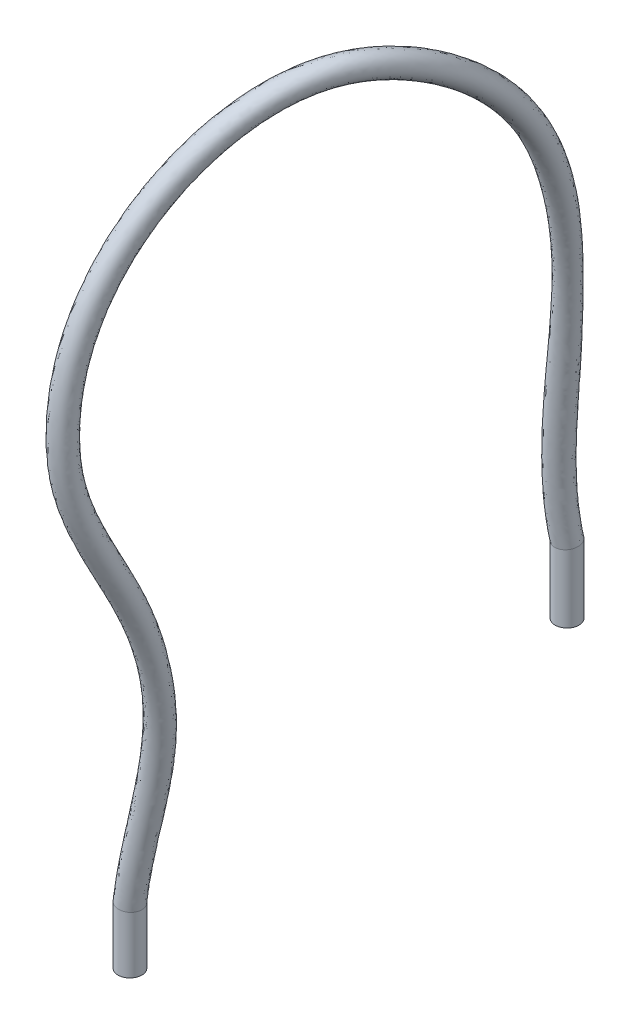
ISO-10303-21;
HEADER;
FILE_DESCRIPTION(('STEP AP214'),'2;1');
FILE_NAME('part.step','',(''),(''),'','','');
FILE_SCHEMA(('AUTOMOTIVE_DESIGN { 1 0 10303 214 1 1 1 1 }'));
ENDSEC;
DATA;
#1=APPLICATION_CONTEXT('core data for automotive mechanical design processes');
#2=APPLICATION_PROTOCOL_DEFINITION('international standard','automotive_design',2000,#1);
#3=PRODUCT_CONTEXT('',#1,'mechanical');
#4=PRODUCT('Part','Part','',(#3));
#5=PRODUCT_RELATED_PRODUCT_CATEGORY('part','',(#4));
#6=PRODUCT_DEFINITION_FORMATION('','',#4);
#7=PRODUCT_DEFINITION_CONTEXT('part definition',#1,'design');
#8=PRODUCT_DEFINITION('design','',#6,#7);
#9=PRODUCT_DEFINITION_SHAPE('','',#8);
#10=(LENGTH_UNIT() NAMED_UNIT(*) SI_UNIT(.MILLI.,.METRE.));
#11=(NAMED_UNIT(*) PLANE_ANGLE_UNIT() SI_UNIT($,.RADIAN.));
#12=(NAMED_UNIT(*) SI_UNIT($,.STERADIAN.) SOLID_ANGLE_UNIT());
#13=UNCERTAINTY_MEASURE_WITH_UNIT(LENGTH_MEASURE(1.E-05),#10,'distance_accuracy_value','');
#14=(GEOMETRIC_REPRESENTATION_CONTEXT(3) GLOBAL_UNCERTAINTY_ASSIGNED_CONTEXT((#13)) GLOBAL_UNIT_ASSIGNED_CONTEXT((#10,
#11,#12)) REPRESENTATION_CONTEXT('',''));
#15=CARTESIAN_POINT('',(0.,0.,0.));
#16=DIRECTION('',(0.,0.,1.));
#17=DIRECTION('',(1.,0.,0.));
#18=AXIS2_PLACEMENT_3D('',#15,#16,#17);
#19=CARTESIAN_POINT('',(25.3532665051609,-57.0295507088447,-38.7450873487546));
#20=DIRECTION('',(0.,-1.,0.));
#21=DIRECTION('',(0.,0.,-1.));
#22=AXIS2_PLACEMENT_3D('',#19,#20,#21);
#23=PLANE('',#22);
#24=CARTESIAN_POINT('',(25.3532665051609,-57.0295507088447,-38.7450873487546));
#25=DIRECTION('',(0.,-1.,0.));
#26=DIRECTION('',(0.,0.,-1.));
#27=AXIS2_PLACEMENT_3D('',#24,#25,#26);
#28=CIRCLE('',#27,1.);
#29=CARTESIAN_POINT('',(25.3532665051609,-57.0295507088447,-39.7450873487547));
#30=VERTEX_POINT('',#29);
#31=EDGE_CURVE('E10',#30,#30,#28,.T.);
#32=ORIENTED_EDGE('',*,*,#31,.T.);
#33=EDGE_LOOP('',(#32));
#34=FACE_BOUND('',#33,.T.);
#35=ADVANCED_FACE('F30',(#34),#23,.T.);
#36=CARTESIAN_POINT('',(25.3532665051609,-48.5011235840985,-38.7450873487546));
#37=DIRECTION('',(0.,-1.,0.));
#38=DIRECTION('',(0.,0.,-1.));
#39=AXIS2_PLACEMENT_3D('',#36,#37,#38);
#40=CYLINDRICAL_SURFACE('',#39,1.);
#41=ORIENTED_EDGE('',*,*,#31,.F.);
#42=EDGE_LOOP('',(#41));
#43=FACE_BOUND('',#42,.T.);
#44=CARTESIAN_POINT('',(24.9215881850007,-51.4202820187368,-37.8430597283883));
#45=CARTESIAN_POINT('',(23.1175329442681,-51.4202820187369,-38.7064163687086));
#46=CARTESIAN_POINT('',(23.9808895845883,-51.2388193989526,-40.5104716094412));
#47=CARTESIAN_POINT('',(25.784944825321,-51.2388193989526,-39.647114969121));
#48=CARTESIAN_POINT('',(27.5890000660536,-51.2388193989526,-38.7837583288007));
#49=CARTESIAN_POINT('',(26.7256434257334,-51.4202820187369,-36.9797030880681));
#50=CARTESIAN_POINT('',(24.9215881850007,-51.4202820187368,-37.8430597283883));
#51=(BOUNDED_CURVE() B_SPLINE_CURVE(3,(#44,#45,#46,#47,#48,#49,#50),.UNSPECIFIED.,.T.,
.F.) B_SPLINE_CURVE_WITH_KNOTS((4,3,4),(0.,0.5,1.),
.UNSPECIFIED.) CURVE() GEOMETRIC_REPRESENTATION_ITEM() RATIONAL_B_SPLINE_CURVE((1.,
0.333333333333333,0.333333333333333,1.,0.333333333333333,0.333333333333333,1.)) REPRESENTATION_ITEM(''));
#52=CARTESIAN_POINT('',(24.9215881850007,-51.4202820187368,-37.8430597283883));
#53=VERTEX_POINT('',#52);
#54=EDGE_CURVE('E41',#53,#53,#51,.T.);
#55=ORIENTED_EDGE('',*,*,#54,.T.);
#56=EDGE_LOOP('',(#55));
#57=FACE_BOUND('',#56,.T.);
#58=ADVANCED_FACE('F32',(#43,#57),#40,.T.);
#59=CARTESIAN_POINT('',(24.9215881850007,-51.4202820187368,-37.8430597283883));
#60=CARTESIAN_POINT('',(24.5591339133004,-46.8313056137431,-37.0856814934281));
#61=CARTESIAN_POINT('',(25.8092457486875,-36.7389905143182,-36.9037739377642));
#62=CARTESIAN_POINT('',(26.4361314583991,-25.8024590427246,-36.775036027988));
#63=CARTESIAN_POINT('',(26.6981465809064,-18.8751157932602,-34.023557030803));
#64=CARTESIAN_POINT('',(26.5802560342086,-15.7861180764835,-32.2047958380945));
#65=CARTESIAN_POINT('',(26.1983669155781,-13.0867333284738,-29.8151528495338));
#66=CARTESIAN_POINT('',(25.5483771684831,-10.9220382148905,-26.9132567599885));
#67=CARTESIAN_POINT('',(24.6777470258107,-9.41398240953499,-23.7120662810517));
#68=CARTESIAN_POINT('',(23.7077072912026,-8.84047981241557,-20.6457831780305));
#69=CARTESIAN_POINT('',(22.7480873793199,-9.20124261370793,-17.9586835398706));
#70=CARTESIAN_POINT('',(21.8612214604253,-10.1314967729939,-15.6616337200219));
#71=CARTESIAN_POINT('',(20.8368725622967,-11.8015806488903,-13.1426303475493));
#72=CARTESIAN_POINT('',(19.7771917549267,-14.3792011532157,-10.5926804171221));
#73=CARTESIAN_POINT('',(18.7830493343858,-17.8015461216313,-8.20988132282541));
#74=CARTESIAN_POINT('',(18.0083510850254,-21.5664696841531,-6.37043273551679));
#75=CARTESIAN_POINT('',(17.5411137617415,-25.5689464510842,-5.18147833587515));
#76=CARTESIAN_POINT('',(17.378049820807,-29.651082627452,-4.70611252120185));
#77=CARTESIAN_POINT('',(17.5327930963441,-36.0116080698568,-5.04765170266777));
#78=CARTESIAN_POINT('',(19.5038174242465,-43.3609448358007,-9.51913534471872));
#79=CARTESIAN_POINT('',(18.7319871485069,-55.2830464004827,-12.0508206055234));
#80=CARTESIAN_POINT('',(16.8932993181099,-63.0907834530144,-10.9624271402832));
#81=CARTESIAN_POINT('',(16.3319470435205,-67.4690153344044,-11.0317659866521));
#82=CARTESIAN_POINT('',(23.1175329442681,-51.4202820187369,-38.7064163687086));
#83=CARTESIAN_POINT('',(22.7693103496974,-47.0114906347263,-37.978776402398));
#84=CARTESIAN_POINT('',(23.5195538271926,-36.330391008565,-37.2735949797808));
#85=CARTESIAN_POINT('',(25.8909853487678,-25.4382371523557,-38.7533822891394));
#86=CARTESIAN_POINT('',(26.1924909624197,-18.0180683435277,-35.7603834247357));
#87=CARTESIAN_POINT('',(26.1134111588455,-14.6603305909889,-33.8040891626216));
#88=CARTESIAN_POINT('',(25.7076222444429,-11.6923702181663,-31.1770242420753));
#89=CARTESIAN_POINT('',(24.944539513388,-9.35344506040196,-28.0145299716167));
#90=CARTESIAN_POINT('',(23.9578666113235,-7.70440965646295,-24.497054895363));
#91=CARTESIAN_POINT('',(22.8437062147662,-7.0500463010631,-21.0112950037319));
#92=CARTESIAN_POINT('',(21.6840678452588,-7.49296248751591,-17.8771773874469));
#93=CARTESIAN_POINT('',(20.6374507267317,-8.57885127999266,-15.3091987293687));
#94=CARTESIAN_POINT('',(19.4483394939678,-10.4625100131158,-12.5751597208772));
#95=CARTESIAN_POINT('',(18.2038675416216,-13.311090298929,-9.94254746656351));
#96=CARTESIAN_POINT('',(17.0976441965246,-16.9980850096519,-7.47350922847832));
#97=CARTESIAN_POINT('',(16.3158561381495,-20.9953308928522,-5.45292251242591));
#98=CARTESIAN_POINT('',(15.8403010933386,-25.2762988924644,-4.15655990342625));
#99=CARTESIAN_POINT('',(15.6864485973249,-29.6603477911991,-3.61585007051087));
#100=CARTESIAN_POINT('',(15.9285865802715,-36.5856126159584,-3.94771174158739));
#101=CARTESIAN_POINT('',(17.749577199673,-44.4325612589177,-8.8545035204825));
#102=CARTESIAN_POINT('',(17.7058941337163,-54.7576410336833,-10.141194727266));
#103=CARTESIAN_POINT('',(15.6708009926034,-63.0479264799969,-9.37768272909865));
#104=CARTESIAN_POINT('',(15.1123342617328,-67.4036527440121,-9.44666514995431));
#105=CARTESIAN_POINT('',(23.9808895845883,-51.2388193989526,-40.5104716094412));
#106=CARTESIAN_POINT('',(23.6326669900177,-46.830028014942,-39.7828316431306));
#107=CARTESIAN_POINT('',(23.8866953353625,-36.6754819484729,-39.5616633304297));
#108=CARTESIAN_POINT('',(27.8477943773701,-25.6944702170099,-39.3901618836336));
#109=CARTESIAN_POINT('',(28.1214944102711,-17.9590382529399,-36.301751832263));
#110=CARTESIAN_POINT('',(28.0687302092423,-14.4136853108548,-34.2174727213419));
#111=CARTESIAN_POINT('',(27.6511727263655,-11.2437949952491,-31.4368287252637));
#112=CARTESIAN_POINT('',(26.84258605812,-8.69892696039117,-28.1435357125398));
#113=CARTESIAN_POINT('',(25.7919921427359,-6.8767095005077,-24.423528198561));
#114=CARTESIAN_POINT('',(24.5873633732582,-6.10306475870911,-20.6483342102403));
#115=CARTESIAN_POINT('',(23.2927163437878,-6.50400038582944,-17.1790726290295));
#116=CARTESIAN_POINT('',(22.1285123309143,-7.60423024855878,-14.378880287242));
#117=CARTESIAN_POINT('',(20.8069741851994,-9.52629174104163,-11.4246550943639));
#118=CARTESIAN_POINT('',(19.3750232967927,-12.3989271662613,-8.58569004212457));
#119=CARTESIAN_POINT('',(18.1363817309849,-16.1938416543386,-5.95473178336462));
#120=CARTESIAN_POINT('',(17.3751520428417,-20.3966313950966,-3.85504914806572));
#121=CARTESIAN_POINT('',(16.8998212399796,-24.879303073433,-2.49822614287816));
#122=CARTESIAN_POINT('',(16.7605942830611,-29.4858019070343,-1.92626757295141));
#123=CARTESIAN_POINT('',(17.0775069175833,-36.80972435661,-2.30207517908569));
#124=CARTESIAN_POINT('',(18.7265996024539,-45.0666671447029,-7.15818490003234));
#125=CARTESIAN_POINT('',(19.4993642947251,-54.7613893383268,-9.08993793558638));
#126=CARTESIAN_POINT('',(17.2559018293012,-63.1587400029276,-8.15806994731094));
#127=CARTESIAN_POINT('',(16.6974350984306,-67.5144662669428,-8.22705236816659));
#128=CARTESIAN_POINT('',(25.784944825321,-51.2388193989526,-39.647114969121));
#129=CARTESIAN_POINT('',(25.4296063921855,-46.7399355044504,-38.9046058684855));
#130=CARTESIAN_POINT('',(26.1725895586364,-37.0359993956322,-39.1839066832897));
#131=CARTESIAN_POINT('',(28.3931603783307,-26.0614761168408,-37.4122751036357));
#132=CARTESIAN_POINT('',(28.6271252775194,-18.8157723311434,-34.5648737185666));
#133=CARTESIAN_POINT('',(28.5355818019064,-15.5395578430434,-32.6181934331725));
#134=CARTESIAN_POINT('',(28.141915524532,-12.6381343921767,-30.0749534189968));
#135=CARTESIAN_POINT('',(27.4464242171129,-10.2675264947171,-27.0422635538551));
#136=CARTESIAN_POINT('',(26.5118724269352,-8.58628060378423,-23.6385393119762));
#137=CARTESIAN_POINT('',(25.4513644739559,-7.89349857799381,-20.2828224353175));
#138=CARTESIAN_POINT('',(24.3567358722114,-8.21228043860885,-17.2605787694528));
#139=CARTESIAN_POINT('',(23.3522830658033,-9.15687576463217,-14.7313152812515));
#140=CARTESIAN_POINT('',(22.1955072546825,-10.8653623534735,-11.9921257193423));
#141=CARTESIAN_POINT('',(20.9483474989802,-13.4670381118424,-9.23582299455224));
#142=CARTESIAN_POINT('',(19.8217869108301,-16.9973024376478,-6.69110387239404));
#143=CARTESIAN_POINT('',(19.0676468362349,-20.9677713837948,-4.77255939014947));
#144=CARTESIAN_POINT('',(18.6006344670918,-25.1719462743508,-3.52314450630568));
#145=CARTESIAN_POINT('',(18.4521934750839,-29.4765525875467,-3.01653027457271));
#146=CARTESIAN_POINT('',(18.6817261504581,-36.2356206265903,-3.402013569371));
#147=CARTESIAN_POINT('',(20.4806999349614,-43.9961418009926,-7.82283400389005));
#148=CARTESIAN_POINT('',(20.5260011795703,-55.2825528247218,-10.9994966344201));
#149=CARTESIAN_POINT('',(18.4769573829483,-63.2128497846325,-9.7429925712521));
#150=CARTESIAN_POINT('',(17.9170478802183,-67.5798288573351,-9.81215320486439));
#151=CARTESIAN_POINT('',(27.5890000660536,-51.2388193989526,-38.7837583288007));
#152=CARTESIAN_POINT('',(27.2265457943533,-46.6498429939588,-38.0263800938404));
#153=CARTESIAN_POINT('',(28.4584837819104,-37.3965168427914,-38.8061500361497));
#154=CARTESIAN_POINT('',(28.9385263792913,-26.4284820166718,-35.4343883236379));
#155=CARTESIAN_POINT('',(29.1327561447678,-19.672506409347,-32.8279956048702));
#156=CARTESIAN_POINT('',(29.0024333945706,-16.665430375232,-31.018914145003));
#157=CARTESIAN_POINT('',(28.6326583226985,-14.0324737891043,-28.71307811273));
#158=CARTESIAN_POINT('',(28.0502623761059,-11.8361260290431,-25.9409913951704));
#159=CARTESIAN_POINT('',(27.2317527111346,-10.2958517070608,-22.8535504253914));
#160=CARTESIAN_POINT('',(26.3153655746535,-9.68393239727851,-19.9173106603946));
#161=CARTESIAN_POINT('',(25.4207554006351,-9.92056049138825,-17.3420849098762));
#162=CARTESIAN_POINT('',(24.5760538006922,-10.7095212807055,-15.0837502752611));
#163=CARTESIAN_POINT('',(23.5840403241657,-12.2044329659055,-12.5595963443208));
#164=CARTESIAN_POINT('',(22.5216717011677,-14.5351490574235,-9.88595594697993));
#165=CARTESIAN_POINT('',(21.5071920906754,-17.8007632209571,-7.42747596142347));
#166=CARTESIAN_POINT('',(20.7601416296282,-21.5389113724929,-5.69006963223322));
#167=CARTESIAN_POINT('',(20.301447694204,-25.4645894752687,-4.54806286973318));
#168=CARTESIAN_POINT('',(20.1437926671068,-29.4673032680591,-4.10679297619403));
#169=CARTESIAN_POINT('',(20.2859453833328,-35.6615168965706,-4.50195195965627));
#170=CARTESIAN_POINT('',(22.234800267469,-42.9256164572823,-8.48748310774776));
#171=CARTESIAN_POINT('',(21.5526380644154,-55.8037163111168,-12.9090553332539));
#172=CARTESIAN_POINT('',(19.6980129365954,-63.2669595663374,-11.3279151951932));
#173=CARTESIAN_POINT('',(19.136660662006,-67.6451914477275,-11.3972540415622));
#174=CARTESIAN_POINT('',(26.7256434257334,-51.4202820187369,-36.9797030880681));
#175=CARTESIAN_POINT('',(26.3489574769033,-46.6511205927598,-36.1925865844582));
#176=CARTESIAN_POINT('',(28.0989376701825,-37.1475900200713,-36.5339528957477));
#177=CARTESIAN_POINT('',(26.9812775680305,-26.1666809330936,-34.7966897668367));
#178=CARTESIAN_POINT('',(27.2038021993932,-19.7321632429926,-32.2867306368702));
#179=CARTESIAN_POINT('',(27.0471009095716,-16.911905561978,-30.6055025135675));
#180=CARTESIAN_POINT('',(26.6891115867134,-14.4810964387812,-28.4532814569923));
#181=CARTESIAN_POINT('',(26.1522148235783,-12.4906313693791,-25.8119835483603));
#182=CARTESIAN_POINT('',(25.397627440298,-11.123555162607,-22.9270776667404));
#183=CARTESIAN_POINT('',(24.571708367639,-10.6309133237681,-20.280271352329));
#184=CARTESIAN_POINT('',(23.812106913381,-10.9095227399,-18.0401896922943));
#185=CARTESIAN_POINT('',(23.0849921941189,-11.6841422659952,-16.0140687106751));
#186=CARTESIAN_POINT('',(22.2254056306255,-13.1406512846649,-13.7101009742213));
#187=CARTESIAN_POINT('',(21.3505159682318,-15.4473120075023,-11.2428133676808));
#188=CARTESIAN_POINT('',(20.468454472247,-18.6050072336106,-8.94625341717251));
#189=CARTESIAN_POINT('',(19.7008460319013,-22.1376084754539,-7.28794295860769));
#190=CARTESIAN_POINT('',(19.2419264301443,-25.861594009704,-6.20639676832404));
#191=CARTESIAN_POINT('',(19.069651044289,-29.6418174637049,-5.79637497189284));
#192=CARTESIAN_POINT('',(19.1369996124166,-35.4376035237551,-6.14759166374813));
#193=CARTESIAN_POINT('',(21.2580576488201,-42.2893284126837,-10.1837671689549));
#194=CARTESIAN_POINT('',(19.7580801632975,-55.8084517672821,-13.9604464837808));
#195=CARTESIAN_POINT('',(18.1157976436163,-63.1336404260319,-12.5471715514677));
#196=CARTESIAN_POINT('',(17.5515598253082,-67.5343779247968,-12.6168668233499));
#197=CARTESIAN_POINT('',(24.9215881850007,-51.4202820187368,-37.8430597283883));
#198=CARTESIAN_POINT('',(24.5591339133004,-46.8313056137431,-37.0856814934281));
#199=CARTESIAN_POINT('',(25.8092457486875,-36.7389905143182,-36.9037739377642));
#200=CARTESIAN_POINT('',(26.4361314583991,-25.8024590427246,-36.775036027988));
#201=CARTESIAN_POINT('',(26.6981465809064,-18.8751157932602,-34.023557030803));
#202=CARTESIAN_POINT('',(26.5802560342086,-15.7861180764835,-32.2047958380945));
#203=CARTESIAN_POINT('',(26.1983669155781,-13.0867333284738,-29.8151528495338));
#204=CARTESIAN_POINT('',(25.5483771684831,-10.9220382148905,-26.9132567599885));
#205=CARTESIAN_POINT('',(24.6777470258107,-9.41398240953499,-23.7120662810517));
#206=CARTESIAN_POINT('',(23.7077072912026,-8.84047981241557,-20.6457831780305));
#207=CARTESIAN_POINT('',(22.7480873793199,-9.20124261370793,-17.9586835398706));
#208=CARTESIAN_POINT('',(21.8612214604253,-10.1314967729939,-15.6616337200219));
#209=CARTESIAN_POINT('',(20.8368725622967,-11.8015806488903,-13.1426303475493));
#210=CARTESIAN_POINT('',(19.7771917549267,-14.3792011532157,-10.5926804171221));
#211=CARTESIAN_POINT('',(18.7830493343858,-17.8015461216313,-8.20988132282541));
#212=CARTESIAN_POINT('',(18.0083510850254,-21.5664696841531,-6.37043273551679));
#213=CARTESIAN_POINT('',(17.5411137617415,-25.5689464510842,-5.18147833587515));
#214=CARTESIAN_POINT('',(17.378049820807,-29.651082627452,-4.70611252120185));
#215=CARTESIAN_POINT('',(17.5327930963441,-36.0116080698568,-5.04765170266777));
#216=CARTESIAN_POINT('',(19.5038174242465,-43.3609448358007,-9.51913534471872));
#217=CARTESIAN_POINT('',(18.7319871485069,-55.2830464004827,-12.0508206055234));
#218=CARTESIAN_POINT('',(16.8932993181099,-63.0907834530144,-10.9624271402832));
#219=CARTESIAN_POINT('',(16.3319470435205,-67.4690153344044,-11.0317659866521));
#220=(BOUNDED_SURFACE() B_SPLINE_SURFACE(3,3,((#59,#60,#61,#62,#63,#64,#65,#66,#67,#68,#69,#70,
#71,#72,#73,#74,#75,#76,#77,#78,#79,#80,#81),(#82,#83,#84,#85,#86,#87,#88,#89,#90,#91,#92,#93,
#94,#95,#96,#97,#98,#99,#100,#101,#102,#103,#104),(#105,#106,#107,#108,#109,#110,#111,#112,#113,
#114,#115,#116,#117,#118,#119,#120,#121,#122,#123,#124,#125,#126,#127),(#128,#129,#130,#131,
#132,#133,#134,#135,#136,#137,#138,#139,#140,#141,#142,#143,#144,#145,#146,#147,#148,#149,#150),
(#151,#152,#153,#154,#155,#156,#157,#158,#159,#160,#161,#162,#163,#164,#165,#166,#167,#168,#169,
#170,#171,#172,#173),(#174,#175,#176,#177,#178,#179,#180,#181,#182,#183,#184,#185,#186,#187,
#188,#189,#190,#191,#192,#193,#194,#195,#196),(#197,#198,#199,#200,#201,#202,#203,#204,#205,
#206,#207,#208,#209,#210,#211,#212,#213,#214,#215,#216,#217,#218,#219)),.UNSPECIFIED.,.T.,.F.,
.F.) B_SPLINE_SURFACE_WITH_KNOTS((4,3,4),(4,1,1,1,1,1,1,1,1,1,1,1,1,1,1,1,1,1,1,1,4),(0.,0.5,
1.),(0.,0.116378047195312,0.243973260024147,0.274445617709678,0.304566428671487,
0.33519491022338,0.366726512128086,0.397972210099595,0.428058189947981,0.450126440654363,
0.472558046590808,0.495746671109911,0.531761846385608,0.568201507857167,0.60419053120673,
0.639610023352582,0.674397233594728,0.708643622688015,0.800173440047887,0.890050659014802,1.),
.UNSPECIFIED.) GEOMETRIC_REPRESENTATION_ITEM() RATIONAL_B_SPLINE_SURFACE(((1.,1.,1.,1.,1.,1.,1.,
1.,1.,1.,1.,1.,1.,1.,1.,1.,1.,1.,1.,1.,1.,1.,1.),(0.333333333333333,0.333333333333333,
0.333333333333333,0.333333333333333,0.333333333333333,0.333333333333333,0.333333333333333,
0.333333333333333,0.333333333333333,0.333333333333333,0.333333333333333,0.333333333333333,
0.333333333333333,0.333333333333333,0.333333333333333,0.333333333333333,0.333333333333333,
0.333333333333333,0.333333333333333,0.333333333333333,0.333333333333333,0.333333333333333,
0.333333333333333),(0.333333333333333,0.333333333333333,0.333333333333333,0.333333333333333,
0.333333333333333,0.333333333333333,0.333333333333333,0.333333333333333,0.333333333333333,
0.333333333333333,0.333333333333333,0.333333333333333,0.333333333333333,0.333333333333333,
0.333333333333333,0.333333333333333,0.333333333333333,0.333333333333333,0.333333333333333,
0.333333333333333,0.333333333333333,0.333333333333333,0.333333333333333),(1.,1.,1.,1.,1.,1.,1.,
1.,1.,1.,1.,1.,1.,1.,1.,1.,1.,1.,1.,1.,1.,1.,1.),(0.333333333333333,0.333333333333333,
0.333333333333333,0.333333333333333,0.333333333333333,0.333333333333333,0.333333333333333,
0.333333333333333,0.333333333333333,0.333333333333333,0.333333333333333,0.333333333333333,
0.333333333333333,0.333333333333333,0.333333333333333,0.333333333333333,0.333333333333333,
0.333333333333333,0.333333333333333,0.333333333333333,0.333333333333333,0.333333333333333,
0.333333333333333),(0.333333333333333,0.333333333333333,0.333333333333333,0.333333333333333,
0.333333333333333,0.333333333333333,0.333333333333333,0.333333333333333,0.333333333333333,
0.333333333333333,0.333333333333333,0.333333333333333,0.333333333333333,0.333333333333333,
0.333333333333333,0.333333333333333,0.333333333333333,0.333333333333333,0.333333333333333,
0.333333333333333,0.333333333333333,0.333333333333333,0.333333333333333),(1.,1.,1.,1.,1.,1.,1.,
1.,1.,1.,1.,1.,1.,1.,1.,1.,1.,1.,1.,1.,1.,1.,1.))) REPRESENTATION_ITEM('') SURFACE());
#221=CARTESIAN_POINT('',(16.3319470435205,-67.4690153344044,-11.0317659866521));
#222=CARTESIAN_POINT('',(15.1123342617328,-67.4036527440121,-9.44666514995431));
#223=CARTESIAN_POINT('',(16.6974350984306,-67.5144662669428,-8.22705236816659));
#224=CARTESIAN_POINT('',(17.9170478802183,-67.5798288573351,-9.81215320486439));
#225=CARTESIAN_POINT('',(19.136660662006,-67.6451914477275,-11.3972540415622));
#226=CARTESIAN_POINT('',(17.5515598253082,-67.5343779247968,-12.6168668233499));
#227=CARTESIAN_POINT('',(16.3319470435205,-67.4690153344044,-11.0317659866521));
#228=(BOUNDED_CURVE() B_SPLINE_CURVE(3,(#221,#222,#223,#224,#225,#226,#227),.UNSPECIFIED.,.T.,
.F.) B_SPLINE_CURVE_WITH_KNOTS((4,3,4),(0.,0.5,1.),
.UNSPECIFIED.) CURVE() GEOMETRIC_REPRESENTATION_ITEM() RATIONAL_B_SPLINE_CURVE((1.,
0.333333333333333,0.333333333333333,1.,0.333333333333333,0.333333333333333,1.)) REPRESENTATION_ITEM(''));
#229=CARTESIAN_POINT('',(16.3319470435205,-67.4690153344044,-11.0317659866521));
#230=VERTEX_POINT('',#229);
#231=EDGE_CURVE('E37',#230,#230,#228,.F.);
#232=ORIENTED_EDGE('',*,*,#54,.F.);
#233=EDGE_LOOP('',(#232));
#234=FACE_BOUND('',#233,.T.);
#235=ORIENTED_EDGE('',*,*,#231,.F.);
#236=EDGE_LOOP('',(#235));
#237=FACE_BOUND('',#236,.T.);
#238=ADVANCED_FACE('F65',(#234,#237),#220,.F.);
#239=CARTESIAN_POINT('',(17.9170478802183,-72.3244220958698,-9.81215320486439));
#240=DIRECTION('',(0.,1.,0.));
#241=DIRECTION('',(-1.,0.,0.));
#242=AXIS2_PLACEMENT_3D('',#239,#240,#241);
#243=PLANE('',#242);
#244=CARTESIAN_POINT('',(17.1244974618694,-72.3244220958698,-10.4219595957582));
#245=DIRECTION('',(0.,1.,0.));
#246=DIRECTION('',(-1.,0.,0.));
#247=AXIS2_PLACEMENT_3D('',#244,#245,#246);
#248=CIRCLE('',#247,0.999999999999997);
#249=CARTESIAN_POINT('',(16.1244974618694,-72.3244220958698,-10.4219595957582));
#250=VERTEX_POINT('',#249);
#251=EDGE_CURVE('E45',#250,#250,#248,.T.);
#252=ORIENTED_EDGE('',*,*,#251,.F.);
#253=EDGE_LOOP('',(#252));
#254=FACE_BOUND('',#253,.T.);
#255=ADVANCED_FACE('F63',(#254),#243,.F.);
#256=CARTESIAN_POINT('',(16.3319470435205,-67.4690153344044,-11.0317659866521));
#257=CARTESIAN_POINT('',(16.3319470435205,-72.3244220958698,-11.0317659866521));
#258=CARTESIAN_POINT('',(17.5515598253082,-67.5343779247968,-12.6168668233499));
#259=CARTESIAN_POINT('',(17.5515598253082,-72.3244220958698,-12.6168668233499));
#260=CARTESIAN_POINT('',(19.136660662006,-67.6451914477275,-11.3972540415622));
#261=CARTESIAN_POINT('',(19.136660662006,-72.3244220958697,-11.3972540415622));
#262=CARTESIAN_POINT('',(17.9170478802183,-67.5798288573351,-9.81215320486439));
#263=CARTESIAN_POINT('',(17.9170478802183,-72.3244220958698,-9.81215320486439));
#264=CARTESIAN_POINT('',(16.6974350984306,-67.5144662669428,-8.22705236816659));
#265=CARTESIAN_POINT('',(16.6974350984306,-72.3244220958698,-8.22705236816659));
#266=CARTESIAN_POINT('',(15.1123342617328,-67.4036527440121,-9.44666514995431));
#267=CARTESIAN_POINT('',(15.1123342617328,-72.3244220958698,-9.44666514995431));
#268=CARTESIAN_POINT('',(16.3319470435205,-67.4690153344044,-11.0317659866521));
#269=CARTESIAN_POINT('',(16.3319470435205,-72.3244220958698,-11.0317659866521));
#270=(BOUNDED_SURFACE() B_SPLINE_SURFACE(3,1,((#256,#257),(#258,#259),(#260,#261),(#262,#263),
(#264,#265),(#266,#267),(#268,#269)),.UNSPECIFIED.,.T.,.F.,.F.) B_SPLINE_SURFACE_WITH_KNOTS((4,
3,4),(2,2),(0.,0.5,1.),(0.,1.),
.UNSPECIFIED.) GEOMETRIC_REPRESENTATION_ITEM() RATIONAL_B_SPLINE_SURFACE(((1.,1.),
(0.333333333333333,0.333333333333333),(0.333333333333333,0.333333333333333),(1.,1.),
(0.333333333333333,0.333333333333333),(0.333333333333333,0.333333333333333),(1.,1.))) REPRESENTATION_ITEM('') SURFACE());
#271=ORIENTED_EDGE('',*,*,#231,.T.);
#272=EDGE_LOOP('',(#271));
#273=FACE_BOUND('',#272,.T.);
#274=ORIENTED_EDGE('',*,*,#251,.T.);
#275=EDGE_LOOP('',(#274));
#276=FACE_BOUND('',#275,.T.);
#277=ADVANCED_FACE('F61',(#273,#276),#270,.T.);
#278=CLOSED_SHELL('',(#35,#58,#238,#255,#277));
#279=MANIFOLD_SOLID_BREP('B2',#278);
#280=ADVANCED_BREP_SHAPE_REPRESENTATION('',(#18,#279),#14);
#281=SHAPE_DEFINITION_REPRESENTATION(#9,#280);
ENDSEC;
END-ISO-10303-21;
